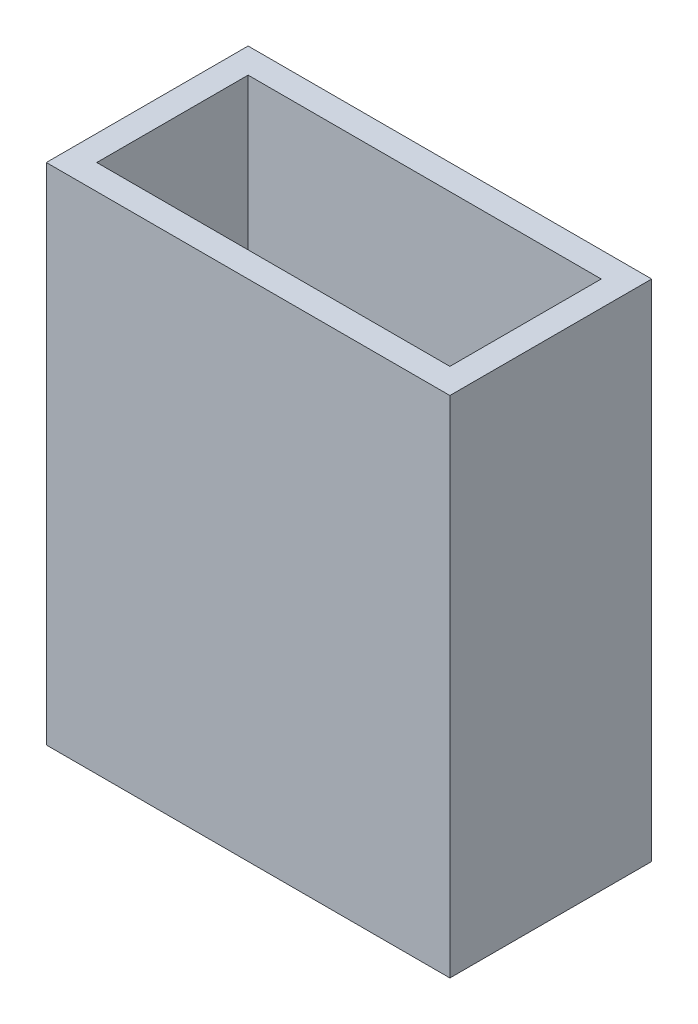
ISO-10303-21;
HEADER;
FILE_DESCRIPTION(('STEP AP214'),'2;1');
FILE_NAME('part.step','',(''),(''),'','','');
FILE_SCHEMA(('AUTOMOTIVE_DESIGN { 1 0 10303 214 1 1 1 1 }'));
ENDSEC;
DATA;
#1=APPLICATION_CONTEXT('core data for automotive mechanical design processes');
#2=APPLICATION_PROTOCOL_DEFINITION('international standard','automotive_design',2000,#1);
#3=PRODUCT_CONTEXT('',#1,'mechanical');
#4=PRODUCT('Part','Part','',(#3));
#5=PRODUCT_RELATED_PRODUCT_CATEGORY('part','',(#4));
#6=PRODUCT_DEFINITION_FORMATION('','',#4);
#7=PRODUCT_DEFINITION_CONTEXT('part definition',#1,'design');
#8=PRODUCT_DEFINITION('design','',#6,#7);
#9=PRODUCT_DEFINITION_SHAPE('','',#8);
#10=(LENGTH_UNIT() NAMED_UNIT(*) SI_UNIT(.MILLI.,.METRE.));
#11=(NAMED_UNIT(*) PLANE_ANGLE_UNIT() SI_UNIT($,.RADIAN.));
#12=(NAMED_UNIT(*) SI_UNIT($,.STERADIAN.) SOLID_ANGLE_UNIT());
#13=UNCERTAINTY_MEASURE_WITH_UNIT(LENGTH_MEASURE(1.E-05),#10,'distance_accuracy_value','');
#14=(GEOMETRIC_REPRESENTATION_CONTEXT(3) GLOBAL_UNCERTAINTY_ASSIGNED_CONTEXT((#13)) GLOBAL_UNIT_ASSIGNED_CONTEXT((#10,
#11,#12)) REPRESENTATION_CONTEXT('',''));
#15=CARTESIAN_POINT('',(0.,0.,0.));
#16=DIRECTION('',(0.,0.,1.));
#17=DIRECTION('',(1.,0.,0.));
#18=AXIS2_PLACEMENT_3D('',#15,#16,#17);
#19=CARTESIAN_POINT('',(0.,63.5,0.));
#20=DIRECTION('',(0.,1.,0.));
#21=DIRECTION('',(0.,0.,1.));
#22=AXIS2_PLACEMENT_3D('',#19,#20,#21);
#23=PLANE('',#22);
#24=DIRECTION('',(0.,0.,-1.));
#25=VECTOR('',#24,1.);
#26=CARTESIAN_POINT('',(25.4,63.5,12.7));
#27=LINE('',#26,#25);
#28=CARTESIAN_POINT('',(25.4,63.5,12.7));
#29=VERTEX_POINT('',#28);
#30=CARTESIAN_POINT('',(25.4,63.5,-12.7));
#31=VERTEX_POINT('',#30);
#32=EDGE_CURVE('E159',#29,#31,#27,.T.);
#33=ORIENTED_EDGE('',*,*,#32,.T.);
#34=DIRECTION('',(-1.,0.,0.));
#35=VECTOR('',#34,1.);
#36=CARTESIAN_POINT('',(-25.4,63.5,-12.7));
#37=LINE('',#36,#35);
#38=CARTESIAN_POINT('',(-25.4,63.5,-12.7));
#39=VERTEX_POINT('',#38);
#40=EDGE_CURVE('E162',#31,#39,#37,.T.);
#41=ORIENTED_EDGE('',*,*,#40,.T.);
#42=DIRECTION('',(0.,0.,1.));
#43=VECTOR('',#42,1.);
#44=CARTESIAN_POINT('',(-25.4,63.5,12.7));
#45=LINE('',#44,#43);
#46=CARTESIAN_POINT('',(-25.4,63.5,12.7));
#47=VERTEX_POINT('',#46);
#48=EDGE_CURVE('E165',#39,#47,#45,.T.);
#49=ORIENTED_EDGE('',*,*,#48,.T.);
#50=DIRECTION('',(1.,0.,0.));
#51=VECTOR('',#50,1.);
#52=CARTESIAN_POINT('',(-25.4,63.5,12.7));
#53=LINE('',#52,#51);
#54=EDGE_CURVE('E167',#47,#29,#53,.T.);
#55=ORIENTED_EDGE('',*,*,#54,.T.);
#56=EDGE_LOOP('',(#33,#41,#49,#55));
#57=FACE_BOUND('',#56,.T.);
#58=DIRECTION('',(-1.,0.,0.));
#59=VECTOR('',#58,1.);
#60=CARTESIAN_POINT('',(0.,63.5,-9.525));
#61=LINE('',#60,#59);
#62=CARTESIAN_POINT('',(22.225,63.5,-9.525));
#63=VERTEX_POINT('',#62);
#64=CARTESIAN_POINT('',(-22.225,63.5,-9.525));
#65=VERTEX_POINT('',#64);
#66=EDGE_CURVE('E131',#63,#65,#61,.T.);
#67=ORIENTED_EDGE('',*,*,#66,.F.);
#68=DIRECTION('',(0.,0.,-1.));
#69=VECTOR('',#68,1.);
#70=CARTESIAN_POINT('',(22.225,63.5,0.));
#71=LINE('',#70,#69);
#72=CARTESIAN_POINT('',(22.225,63.5,9.525));
#73=VERTEX_POINT('',#72);
#74=EDGE_CURVE('E123',#73,#63,#71,.T.);
#75=ORIENTED_EDGE('',*,*,#74,.F.);
#76=DIRECTION('',(1.,0.,0.));
#77=VECTOR('',#76,1.);
#78=CARTESIAN_POINT('',(0.,63.5,9.525));
#79=LINE('',#78,#77);
#80=CARTESIAN_POINT('',(-22.225,63.5,9.525));
#81=VERTEX_POINT('',#80);
#82=EDGE_CURVE('E145',#81,#73,#79,.T.);
#83=ORIENTED_EDGE('',*,*,#82,.F.);
#84=DIRECTION('',(0.,0.,1.));
#85=VECTOR('',#84,1.);
#86=CARTESIAN_POINT('',(-22.225,63.5,0.));
#87=LINE('',#86,#85);
#88=EDGE_CURVE('E143',#65,#81,#87,.T.);
#89=ORIENTED_EDGE('',*,*,#88,.F.);
#90=EDGE_LOOP('',(#67,#75,#83,#89));
#91=FACE_BOUND('',#90,.T.);
#92=ADVANCED_FACE('F58',(#57,#91),#23,.T.);
#93=CARTESIAN_POINT('',(0.,0.,0.));
#94=DIRECTION('',(0.,1.,0.));
#95=DIRECTION('',(0.,0.,1.));
#96=AXIS2_PLACEMENT_3D('',#93,#94,#95);
#97=PLANE('',#96);
#98=DIRECTION('',(0.,0.,-1.));
#99=VECTOR('',#98,1.);
#100=CARTESIAN_POINT('',(25.4,0.,12.7));
#101=LINE('',#100,#99);
#102=CARTESIAN_POINT('',(25.4,0.,12.7));
#103=VERTEX_POINT('',#102);
#104=CARTESIAN_POINT('',(25.4,0.,-12.7));
#105=VERTEX_POINT('',#104);
#106=EDGE_CURVE('E139',#103,#105,#101,.T.);
#107=ORIENTED_EDGE('',*,*,#106,.F.);
#108=DIRECTION('',(1.,0.,0.));
#109=VECTOR('',#108,1.);
#110=CARTESIAN_POINT('',(-25.4,0.,12.7));
#111=LINE('',#110,#109);
#112=CARTESIAN_POINT('',(-25.4,0.,12.7));
#113=VERTEX_POINT('',#112);
#114=EDGE_CURVE('E163',#113,#103,#111,.T.);
#115=ORIENTED_EDGE('',*,*,#114,.F.);
#116=DIRECTION('',(0.,0.,1.));
#117=VECTOR('',#116,1.);
#118=CARTESIAN_POINT('',(-25.4,0.,12.7));
#119=LINE('',#118,#117);
#120=CARTESIAN_POINT('',(-25.4,0.,-12.7));
#121=VERTEX_POINT('',#120);
#122=EDGE_CURVE('E174',#121,#113,#119,.T.);
#123=ORIENTED_EDGE('',*,*,#122,.F.);
#124=DIRECTION('',(-1.,0.,0.));
#125=VECTOR('',#124,1.);
#126=CARTESIAN_POINT('',(-25.4,0.,-12.7));
#127=LINE('',#126,#125);
#128=EDGE_CURVE('E172',#105,#121,#127,.T.);
#129=ORIENTED_EDGE('',*,*,#128,.F.);
#130=EDGE_LOOP('',(#107,#115,#123,#129));
#131=FACE_BOUND('',#130,.T.);
#132=DIRECTION('',(0.,0.,-1.));
#133=VECTOR('',#132,1.);
#134=CARTESIAN_POINT('',(22.225,0.,0.));
#135=LINE('',#134,#133);
#136=CARTESIAN_POINT('',(22.225,0.,9.525));
#137=VERTEX_POINT('',#136);
#138=CARTESIAN_POINT('',(22.225,0.,-9.525));
#139=VERTEX_POINT('',#138);
#140=EDGE_CURVE('E81',#137,#139,#135,.T.);
#141=ORIENTED_EDGE('',*,*,#140,.T.);
#142=DIRECTION('',(-1.,0.,0.));
#143=VECTOR('',#142,1.);
#144=CARTESIAN_POINT('',(0.,0.,-9.525));
#145=LINE('',#144,#143);
#146=CARTESIAN_POINT('',(-22.225,0.,-9.525));
#147=VERTEX_POINT('',#146);
#148=EDGE_CURVE('E138',#139,#147,#145,.T.);
#149=ORIENTED_EDGE('',*,*,#148,.T.);
#150=DIRECTION('',(0.,0.,1.));
#151=VECTOR('',#150,1.);
#152=CARTESIAN_POINT('',(-22.225,0.,0.));
#153=LINE('',#152,#151);
#154=CARTESIAN_POINT('',(-22.225,0.,9.525));
#155=VERTEX_POINT('',#154);
#156=EDGE_CURVE('E151',#147,#155,#153,.T.);
#157=ORIENTED_EDGE('',*,*,#156,.T.);
#158=DIRECTION('',(1.,0.,0.));
#159=VECTOR('',#158,1.);
#160=CARTESIAN_POINT('',(0.,0.,9.525));
#161=LINE('',#160,#159);
#162=EDGE_CURVE('E132',#155,#137,#161,.T.);
#163=ORIENTED_EDGE('',*,*,#162,.T.);
#164=EDGE_LOOP('',(#141,#149,#157,#163));
#165=FACE_BOUND('',#164,.T.);
#166=ADVANCED_FACE('F192',(#131,#165),#97,.F.);
#167=CARTESIAN_POINT('',(25.4,63.5,12.7));
#168=DIRECTION('',(-1.,0.,0.));
#169=DIRECTION('',(0.,0.,1.));
#170=AXIS2_PLACEMENT_3D('',#167,#168,#169);
#171=PLANE('',#170);
#172=ORIENTED_EDGE('',*,*,#106,.T.);
#173=DIRECTION('',(0.,-1.,0.));
#174=VECTOR('',#173,1.);
#175=CARTESIAN_POINT('',(25.4,63.5,-12.7));
#176=LINE('',#175,#174);
#177=EDGE_CURVE('E12',#31,#105,#176,.T.);
#178=ORIENTED_EDGE('',*,*,#177,.F.);
#179=ORIENTED_EDGE('',*,*,#32,.F.);
#180=DIRECTION('',(0.,-1.,0.));
#181=VECTOR('',#180,1.);
#182=CARTESIAN_POINT('',(25.4,63.5,12.7));
#183=LINE('',#182,#181);
#184=EDGE_CURVE('E169',#29,#103,#183,.T.);
#185=ORIENTED_EDGE('',*,*,#184,.T.);
#186=EDGE_LOOP('',(#172,#178,#179,#185));
#187=FACE_BOUND('',#186,.T.);
#188=ADVANCED_FACE('F60',(#187),#171,.F.);
#189=CARTESIAN_POINT('',(-25.4,63.5,-12.7));
#190=DIRECTION('',(0.,0.,1.));
#191=DIRECTION('',(1.,0.,0.));
#192=AXIS2_PLACEMENT_3D('',#189,#190,#191);
#193=PLANE('',#192);
#194=ORIENTED_EDGE('',*,*,#128,.T.);
#195=DIRECTION('',(0.,-1.,0.));
#196=VECTOR('',#195,1.);
#197=CARTESIAN_POINT('',(-25.4,63.5,-12.7));
#198=LINE('',#197,#196);
#199=EDGE_CURVE('E66',#39,#121,#198,.T.);
#200=ORIENTED_EDGE('',*,*,#199,.F.);
#201=ORIENTED_EDGE('',*,*,#40,.F.);
#202=ORIENTED_EDGE('',*,*,#177,.T.);
#203=EDGE_LOOP('',(#194,#200,#201,#202));
#204=FACE_BOUND('',#203,.T.);
#205=ADVANCED_FACE('F202',(#204),#193,.F.);
#206=CARTESIAN_POINT('',(-25.4,63.5,12.7));
#207=DIRECTION('',(1.,0.,0.));
#208=DIRECTION('',(0.,0.,-1.));
#209=AXIS2_PLACEMENT_3D('',#206,#207,#208);
#210=PLANE('',#209);
#211=ORIENTED_EDGE('',*,*,#122,.T.);
#212=DIRECTION('',(0.,-1.,0.));
#213=VECTOR('',#212,1.);
#214=CARTESIAN_POINT('',(-25.4,63.5,12.7));
#215=LINE('',#214,#213);
#216=EDGE_CURVE('E179',#47,#113,#215,.T.);
#217=ORIENTED_EDGE('',*,*,#216,.F.);
#218=ORIENTED_EDGE('',*,*,#48,.F.);
#219=ORIENTED_EDGE('',*,*,#199,.T.);
#220=EDGE_LOOP('',(#211,#217,#218,#219));
#221=FACE_BOUND('',#220,.T.);
#222=ADVANCED_FACE('F186',(#221),#210,.F.);
#223=CARTESIAN_POINT('',(-25.4,63.5,12.7));
#224=DIRECTION('',(0.,0.,-1.));
#225=DIRECTION('',(-1.,0.,0.));
#226=AXIS2_PLACEMENT_3D('',#223,#224,#225);
#227=PLANE('',#226);
#228=ORIENTED_EDGE('',*,*,#114,.T.);
#229=ORIENTED_EDGE('',*,*,#184,.F.);
#230=ORIENTED_EDGE('',*,*,#54,.F.);
#231=ORIENTED_EDGE('',*,*,#216,.T.);
#232=EDGE_LOOP('',(#228,#229,#230,#231));
#233=FACE_BOUND('',#232,.T.);
#234=ADVANCED_FACE('F196',(#233),#227,.F.);
#235=CARTESIAN_POINT('',(22.225,63.5,0.));
#236=DIRECTION('',(-1.,0.,0.));
#237=DIRECTION('',(0.,0.,1.));
#238=AXIS2_PLACEMENT_3D('',#235,#236,#237);
#239=PLANE('',#238);
#240=ORIENTED_EDGE('',*,*,#140,.F.);
#241=DIRECTION('',(0.,-1.,0.));
#242=VECTOR('',#241,1.);
#243=CARTESIAN_POINT('',(22.225,63.5,9.525));
#244=LINE('',#243,#242);
#245=EDGE_CURVE('E127',#73,#137,#244,.T.);
#246=ORIENTED_EDGE('',*,*,#245,.F.);
#247=ORIENTED_EDGE('',*,*,#74,.T.);
#248=DIRECTION('',(0.,-1.,0.));
#249=VECTOR('',#248,1.);
#250=CARTESIAN_POINT('',(22.225,63.5,-9.525));
#251=LINE('',#250,#249);
#252=EDGE_CURVE('E126',#63,#139,#251,.T.);
#253=ORIENTED_EDGE('',*,*,#252,.T.);
#254=EDGE_LOOP('',(#240,#246,#247,#253));
#255=FACE_BOUND('',#254,.T.);
#256=ADVANCED_FACE('F125',(#255),#239,.T.);
#257=CARTESIAN_POINT('',(0.,63.5,-9.525));
#258=DIRECTION('',(0.,0.,1.));
#259=DIRECTION('',(1.,0.,0.));
#260=AXIS2_PLACEMENT_3D('',#257,#258,#259);
#261=PLANE('',#260);
#262=ORIENTED_EDGE('',*,*,#148,.F.);
#263=ORIENTED_EDGE('',*,*,#252,.F.);
#264=ORIENTED_EDGE('',*,*,#66,.T.);
#265=DIRECTION('',(0.,-1.,0.));
#266=VECTOR('',#265,1.);
#267=CARTESIAN_POINT('',(-22.225,63.5,-9.525));
#268=LINE('',#267,#266);
#269=EDGE_CURVE('E140',#65,#147,#268,.T.);
#270=ORIENTED_EDGE('',*,*,#269,.T.);
#271=EDGE_LOOP('',(#262,#263,#264,#270));
#272=FACE_BOUND('',#271,.T.);
#273=ADVANCED_FACE('F135',(#272),#261,.T.);
#274=CARTESIAN_POINT('',(-22.225,63.5,0.));
#275=DIRECTION('',(1.,0.,0.));
#276=DIRECTION('',(0.,0.,-1.));
#277=AXIS2_PLACEMENT_3D('',#274,#275,#276);
#278=PLANE('',#277);
#279=ORIENTED_EDGE('',*,*,#156,.F.);
#280=ORIENTED_EDGE('',*,*,#269,.F.);
#281=ORIENTED_EDGE('',*,*,#88,.T.);
#282=DIRECTION('',(0.,-1.,0.));
#283=VECTOR('',#282,1.);
#284=CARTESIAN_POINT('',(-22.225,63.5,9.525));
#285=LINE('',#284,#283);
#286=EDGE_CURVE('E73',#81,#155,#285,.T.);
#287=ORIENTED_EDGE('',*,*,#286,.T.);
#288=EDGE_LOOP('',(#279,#280,#281,#287));
#289=FACE_BOUND('',#288,.T.);
#290=ADVANCED_FACE('F225',(#289),#278,.T.);
#291=CARTESIAN_POINT('',(0.,63.5,9.525));
#292=DIRECTION('',(0.,0.,-1.));
#293=DIRECTION('',(-1.,0.,0.));
#294=AXIS2_PLACEMENT_3D('',#291,#292,#293);
#295=PLANE('',#294);
#296=ORIENTED_EDGE('',*,*,#162,.F.);
#297=ORIENTED_EDGE('',*,*,#286,.F.);
#298=ORIENTED_EDGE('',*,*,#82,.T.);
#299=ORIENTED_EDGE('',*,*,#245,.T.);
#300=EDGE_LOOP('',(#296,#297,#298,#299));
#301=FACE_BOUND('',#300,.T.);
#302=ADVANCED_FACE('F229',(#301),#295,.T.);
#303=CLOSED_SHELL('',(#92,#166,#188,#205,#222,#234,#256,#273,#290,#302));
#304=MANIFOLD_SOLID_BREP('B2',#303);
#305=ADVANCED_BREP_SHAPE_REPRESENTATION('',(#18,#304),#14);
#306=SHAPE_DEFINITION_REPRESENTATION(#9,#305);
ENDSEC;
END-ISO-10303-21;
